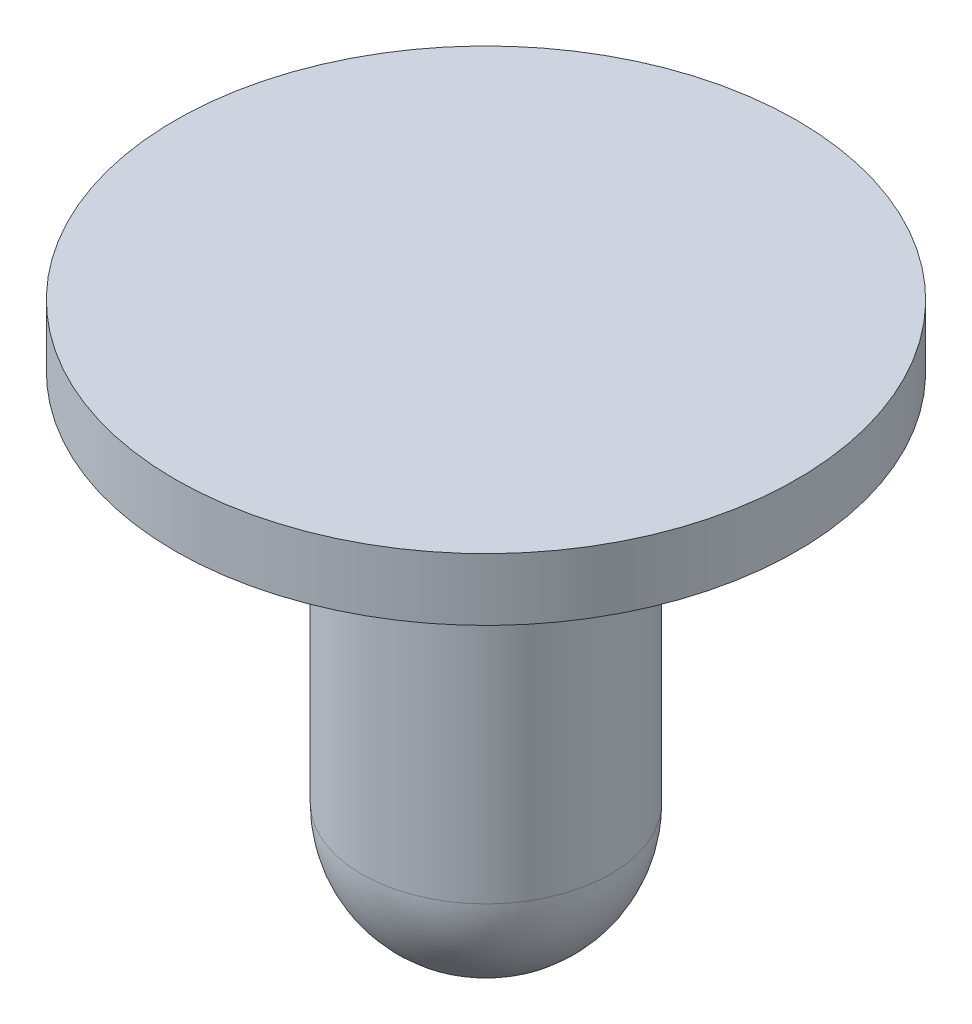
ISO-10303-21;
HEADER;
FILE_DESCRIPTION(('STEP AP214'),'2;1');
FILE_NAME('part.step','',(''),(''),'','','');
FILE_SCHEMA(('AUTOMOTIVE_DESIGN { 1 0 10303 214 1 1 1 1 }'));
ENDSEC;
DATA;
#1=APPLICATION_CONTEXT('core data for automotive mechanical design processes');
#2=APPLICATION_PROTOCOL_DEFINITION('international standard','automotive_design',2000,#1);
#3=PRODUCT_CONTEXT('',#1,'mechanical');
#4=PRODUCT('Part','Part','',(#3));
#5=PRODUCT_RELATED_PRODUCT_CATEGORY('part','',(#4));
#6=PRODUCT_DEFINITION_FORMATION('','',#4);
#7=PRODUCT_DEFINITION_CONTEXT('part definition',#1,'design');
#8=PRODUCT_DEFINITION('design','',#6,#7);
#9=PRODUCT_DEFINITION_SHAPE('','',#8);
#10=(LENGTH_UNIT() NAMED_UNIT(*) SI_UNIT(.MILLI.,.METRE.));
#11=(NAMED_UNIT(*) PLANE_ANGLE_UNIT() SI_UNIT($,.RADIAN.));
#12=(NAMED_UNIT(*) SI_UNIT($,.STERADIAN.) SOLID_ANGLE_UNIT());
#13=UNCERTAINTY_MEASURE_WITH_UNIT(LENGTH_MEASURE(1.E-05),#10,'distance_accuracy_value','');
#14=(GEOMETRIC_REPRESENTATION_CONTEXT(3) GLOBAL_UNCERTAINTY_ASSIGNED_CONTEXT((#13)) GLOBAL_UNIT_ASSIGNED_CONTEXT((#10,
#11,#12)) REPRESENTATION_CONTEXT('',''));
#15=CARTESIAN_POINT('',(0.,0.,0.));
#16=DIRECTION('',(0.,0.,1.));
#17=DIRECTION('',(1.,0.,0.));
#18=AXIS2_PLACEMENT_3D('',#15,#16,#17);
#19=CARTESIAN_POINT('',(0.,2.54,0.));
#20=DIRECTION('',(0.,-1.,0.));
#21=DIRECTION('',(0.,0.,-1.));
#22=AXIS2_PLACEMENT_3D('',#19,#20,#21);
#23=CYLINDRICAL_SURFACE('',#22,12.7);
#24=CARTESIAN_POINT('',(0.,2.54,0.));
#25=DIRECTION('',(0.,1.,0.));
#26=DIRECTION('',(0.,0.,1.));
#27=AXIS2_PLACEMENT_3D('',#24,#25,#26);
#28=CIRCLE('',#27,12.7);
#29=CARTESIAN_POINT('',(0.,2.54,12.7));
#30=VERTEX_POINT('',#29);
#31=EDGE_CURVE('E51',#30,#30,#28,.T.);
#32=ORIENTED_EDGE('',*,*,#31,.F.);
#33=EDGE_LOOP('',(#32));
#34=FACE_BOUND('',#33,.T.);
#35=CARTESIAN_POINT('',(0.,0.,0.));
#36=DIRECTION('',(0.,1.,0.));
#37=DIRECTION('',(0.,0.,1.));
#38=AXIS2_PLACEMENT_3D('',#35,#36,#37);
#39=CIRCLE('',#38,12.7);
#40=CARTESIAN_POINT('',(0.,0.,12.7));
#41=VERTEX_POINT('',#40);
#42=EDGE_CURVE('E46',#41,#41,#39,.T.);
#43=ORIENTED_EDGE('',*,*,#42,.T.);
#44=EDGE_LOOP('',(#43));
#45=FACE_BOUND('',#44,.T.);
#46=ADVANCED_FACE('F43',(#34,#45),#23,.T.);
#47=CARTESIAN_POINT('',(0.,2.54,0.));
#48=DIRECTION('',(0.,1.,0.));
#49=DIRECTION('',(0.,0.,1.));
#50=AXIS2_PLACEMENT_3D('',#47,#48,#49);
#51=PLANE('',#50);
#52=ORIENTED_EDGE('',*,*,#31,.T.);
#53=EDGE_LOOP('',(#52));
#54=FACE_BOUND('',#53,.T.);
#55=ADVANCED_FACE('F71',(#54),#51,.T.);
#56=CARTESIAN_POINT('',(0.,0.,0.));
#57=DIRECTION('',(0.,1.,0.));
#58=DIRECTION('',(0.,0.,1.));
#59=AXIS2_PLACEMENT_3D('',#56,#57,#58);
#60=PLANE('',#59);
#61=CARTESIAN_POINT('',(0.,0.,0.));
#62=DIRECTION('',(0.,-1.,0.));
#63=DIRECTION('',(0.,0.,-1.));
#64=AXIS2_PLACEMENT_3D('',#61,#62,#63);
#65=CIRCLE('',#64,5.08);
#66=CARTESIAN_POINT('',(0.,0.,5.08));
#67=VERTEX_POINT('',#66);
#68=EDGE_CURVE('E10',#67,#67,#65,.T.);
#69=ORIENTED_EDGE('',*,*,#68,.F.);
#70=EDGE_LOOP('',(#69));
#71=FACE_BOUND('',#70,.T.);
#72=ORIENTED_EDGE('',*,*,#42,.F.);
#73=EDGE_LOOP('',(#72));
#74=FACE_BOUND('',#73,.T.);
#75=ADVANCED_FACE('F68',(#71,#74),#60,.F.);
#76=CARTESIAN_POINT('',(0.,-15.24,0.));
#77=DIRECTION('',(0.,1.,0.));
#78=DIRECTION('',(0.,0.,1.));
#79=AXIS2_PLACEMENT_3D('',#76,#77,#78);
#80=CYLINDRICAL_SURFACE('',#79,5.08);
#81=CARTESIAN_POINT('',(0.,-15.24,0.));
#82=DIRECTION('',(0.,-1.,0.));
#83=DIRECTION('',(0.,0.,-1.));
#84=AXIS2_PLACEMENT_3D('',#81,#82,#83);
#85=CIRCLE('',#84,5.08);
#86=CARTESIAN_POINT('',(0.,-15.24,5.08));
#87=VERTEX_POINT('',#86);
#88=EDGE_CURVE('E58',#87,#87,#85,.T.);
#89=CARTESIAN_POINT('',(0.,-15.24,5.08));
#90=CARTESIAN_POINT('',(0.,-15.08125,5.08));
#91=CARTESIAN_POINT('',(0.,-14.9225,5.08));
#92=CARTESIAN_POINT('',(0.,-14.605,5.08));
#93=CARTESIAN_POINT('',(0.,-14.44625,5.08));
#94=CARTESIAN_POINT('',(0.,-14.12875,5.08));
#95=CARTESIAN_POINT('',(0.,-13.97,5.08));
#96=CARTESIAN_POINT('',(0.,-13.6525,5.08));
#97=CARTESIAN_POINT('',(0.,-13.49375,5.08));
#98=CARTESIAN_POINT('',(0.,-13.17625,5.08));
#99=CARTESIAN_POINT('',(0.,-13.0175,5.08));
#100=CARTESIAN_POINT('',(0.,-12.7,5.08));
#101=CARTESIAN_POINT('',(0.,-12.54125,5.08));
#102=CARTESIAN_POINT('',(0.,-12.22375,5.08));
#103=CARTESIAN_POINT('',(0.,-12.065,5.08));
#104=CARTESIAN_POINT('',(0.,-11.7475,5.08));
#105=CARTESIAN_POINT('',(0.,-11.58875,5.08));
#106=CARTESIAN_POINT('',(0.,-11.27125,5.08));
#107=CARTESIAN_POINT('',(0.,-11.1125,5.08));
#108=CARTESIAN_POINT('',(0.,-10.795,5.08));
#109=CARTESIAN_POINT('',(0.,-10.63625,5.08));
#110=CARTESIAN_POINT('',(0.,-10.31875,5.08));
#111=CARTESIAN_POINT('',(0.,-10.16,5.08));
#112=CARTESIAN_POINT('',(0.,-9.8425,5.08));
#113=CARTESIAN_POINT('',(0.,-9.68375,5.08));
#114=CARTESIAN_POINT('',(0.,-9.36625,5.08));
#115=CARTESIAN_POINT('',(0.,-9.2075,5.08));
#116=CARTESIAN_POINT('',(0.,-8.89,5.08));
#117=CARTESIAN_POINT('',(0.,-8.73125,5.08));
#118=CARTESIAN_POINT('',(0.,-8.41375,5.08));
#119=CARTESIAN_POINT('',(0.,-8.255,5.08));
#120=CARTESIAN_POINT('',(0.,-7.9375,5.08));
#121=CARTESIAN_POINT('',(0.,-7.77875,5.08));
#122=CARTESIAN_POINT('',(0.,-7.46125,5.08));
#123=CARTESIAN_POINT('',(0.,-7.3025,5.08));
#124=CARTESIAN_POINT('',(0.,-6.985,5.08));
#125=CARTESIAN_POINT('',(0.,-6.82625,5.08));
#126=CARTESIAN_POINT('',(0.,-6.50875,5.08));
#127=CARTESIAN_POINT('',(0.,-6.35,5.08));
#128=CARTESIAN_POINT('',(0.,-6.0325,5.08));
#129=CARTESIAN_POINT('',(0.,-5.87375,5.08));
#130=CARTESIAN_POINT('',(0.,-5.55625,5.08));
#131=CARTESIAN_POINT('',(0.,-5.3975,5.08));
#132=CARTESIAN_POINT('',(0.,-5.08,5.08));
#133=CARTESIAN_POINT('',(0.,-4.92125,5.08));
#134=CARTESIAN_POINT('',(0.,-4.60375,5.08));
#135=CARTESIAN_POINT('',(0.,-4.445,5.08));
#136=CARTESIAN_POINT('',(0.,-4.1275,5.08));
#137=CARTESIAN_POINT('',(0.,-3.96875,5.08));
#138=CARTESIAN_POINT('',(0.,-3.65125,5.08));
#139=CARTESIAN_POINT('',(0.,-3.4925,5.08));
#140=CARTESIAN_POINT('',(0.,-3.175,5.08));
#141=CARTESIAN_POINT('',(0.,-3.01625,5.08));
#142=CARTESIAN_POINT('',(0.,-2.69875,5.08));
#143=CARTESIAN_POINT('',(0.,-2.54,5.08));
#144=CARTESIAN_POINT('',(0.,-2.2225,5.08));
#145=CARTESIAN_POINT('',(0.,-2.06375,5.08));
#146=CARTESIAN_POINT('',(0.,-1.74625,5.08));
#147=CARTESIAN_POINT('',(0.,-1.5875,5.08));
#148=CARTESIAN_POINT('',(0.,-1.27,5.08));
#149=CARTESIAN_POINT('',(0.,-1.11125,5.08));
#150=CARTESIAN_POINT('',(0.,-0.79375,5.08));
#151=CARTESIAN_POINT('',(0.,-0.634999999999999,5.08));
#152=CARTESIAN_POINT('',(0.,-0.3175,5.08));
#153=CARTESIAN_POINT('',(0.,-0.15875,5.08));
#154=CARTESIAN_POINT('',(0.,0.,5.08));
#155=B_SPLINE_CURVE_WITH_KNOTS('',3,(#89,#90,#91,#92,#93,#94,#95,#96,#97,#98,#99,#100,#101,#102,
#103,#104,#105,#106,#107,#108,#109,#110,#111,#112,#113,#114,#115,#116,#117,#118,#119,#120,#121,
#122,#123,#124,#125,#126,#127,#128,#129,#130,#131,#132,#133,#134,#135,#136,#137,#138,#139,#140,
#141,#142,#143,#144,#145,#146,#147,#148,#149,#150,#151,#152,#153,#154),.UNSPECIFIED.,.F.,.F.,(4,
2,2,2,2,2,2,2,2,2,2,2,2,2,2,2,2,2,2,2,2,2,2,2,2,2,2,2,2,2,2,2,4),(0.,0.476250000000001,0.9525,
1.42875,1.905,2.38125,2.8575,3.33375,3.81,4.28625,4.7625,5.23875,5.715,6.19125,6.6675,7.14375,
7.62,8.09625,8.5725,9.04875,9.525,10.00125,10.4775,10.95375,11.43,11.90625,12.3825,12.85875,
13.335,13.81125,14.2875,14.76375,15.24),.UNSPECIFIED.);
#156=EDGE_CURVE('BSEAM70',#87,#67,#155,.T.);
#157=ORIENTED_EDGE('',*,*,#88,.F.);
#158=ORIENTED_EDGE('',*,*,#68,.T.);
#159=ORIENTED_EDGE('',*,*,#156,.T.);
#160=ORIENTED_EDGE('',*,*,#156,.F.);
#161=EDGE_LOOP('',(#157,#159,#158,#160));
#162=FACE_BOUND('',#161,.T.);
#163=ADVANCED_FACE('F70',(#162),#80,.T.);
#164=CARTESIAN_POINT('',(0.,-15.24,0.));
#165=DIRECTION('',(0.,1.,0.));
#166=DIRECTION('',(0.,0.,1.));
#167=AXIS2_PLACEMENT_3D('',#164,#165,#166);
#168=SPHERICAL_SURFACE('',#167,5.08);
#169=ORIENTED_EDGE('',*,*,#88,.T.);
#170=EDGE_LOOP('',(#169));
#171=FACE_BOUND('',#170,.T.);
#172=ADVANCED_FACE('F77',(#171),#168,.T.);
#173=CLOSED_SHELL('',(#46,#55,#75,#163,#172));
#174=MANIFOLD_SOLID_BREP('B2',#173);
#175=ADVANCED_BREP_SHAPE_REPRESENTATION('',(#18,#174),#14);
#176=SHAPE_DEFINITION_REPRESENTATION(#9,#175);
ENDSEC;
END-ISO-10303-21;
